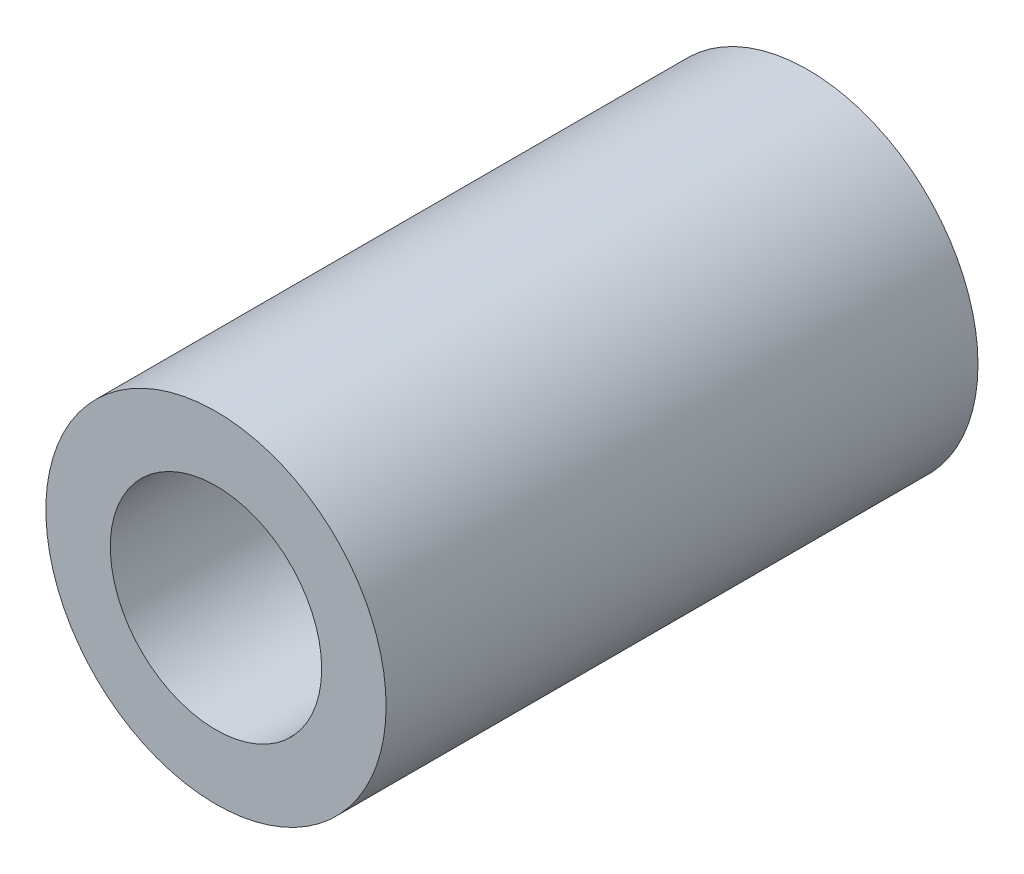
ISO-10303-21;
HEADER;
FILE_DESCRIPTION(('STEP AP214'),'2;1');
FILE_NAME('part.step','',(''),(''),'','','');
FILE_SCHEMA(('AUTOMOTIVE_DESIGN { 1 0 10303 214 1 1 1 1 }'));
ENDSEC;
DATA;
#1=APPLICATION_CONTEXT('core data for automotive mechanical design processes');
#2=APPLICATION_PROTOCOL_DEFINITION('international standard','automotive_design',2000,#1);
#3=PRODUCT_CONTEXT('',#1,'mechanical');
#4=PRODUCT('Part','Part','',(#3));
#5=PRODUCT_RELATED_PRODUCT_CATEGORY('part','',(#4));
#6=PRODUCT_DEFINITION_FORMATION('','',#4);
#7=PRODUCT_DEFINITION_CONTEXT('part definition',#1,'design');
#8=PRODUCT_DEFINITION('design','',#6,#7);
#9=PRODUCT_DEFINITION_SHAPE('','',#8);
#10=(LENGTH_UNIT() NAMED_UNIT(*) SI_UNIT(.MILLI.,.METRE.));
#11=(NAMED_UNIT(*) PLANE_ANGLE_UNIT() SI_UNIT($,.RADIAN.));
#12=(NAMED_UNIT(*) SI_UNIT($,.STERADIAN.) SOLID_ANGLE_UNIT());
#13=UNCERTAINTY_MEASURE_WITH_UNIT(LENGTH_MEASURE(1.E-05),#10,'distance_accuracy_value','');
#14=(GEOMETRIC_REPRESENTATION_CONTEXT(3) GLOBAL_UNCERTAINTY_ASSIGNED_CONTEXT((#13)) GLOBAL_UNIT_ASSIGNED_CONTEXT((#10,
#11,#12)) REPRESENTATION_CONTEXT('',''));
#15=CARTESIAN_POINT('',(0.,0.,0.));
#16=DIRECTION('',(0.,0.,1.));
#17=DIRECTION('',(1.,0.,0.));
#18=AXIS2_PLACEMENT_3D('',#15,#16,#17);
#19=CARTESIAN_POINT('',(0.,0.,11.1125));
#20=DIRECTION('',(0.,0.,1.));
#21=DIRECTION('',(1.,0.,0.));
#22=AXIS2_PLACEMENT_3D('',#19,#20,#21);
#23=PLANE('',#22);
#24=CARTESIAN_POINT('',(0.,0.,11.1125));
#25=DIRECTION('',(0.,0.,1.));
#26=DIRECTION('',(1.,0.,0.));
#27=AXIS2_PLACEMENT_3D('',#24,#25,#26);
#28=CIRCLE('',#27,6.3881);
#29=CARTESIAN_POINT('',(6.3881,0.,11.1125));
#30=VERTEX_POINT('',#29);
#31=EDGE_CURVE('E10',#30,#30,#28,.T.);
#32=ORIENTED_EDGE('',*,*,#31,.T.);
#33=EDGE_LOOP('',(#32));
#34=FACE_BOUND('',#33,.T.);
#35=CARTESIAN_POINT('',(0.,0.,11.1125));
#36=DIRECTION('',(0.,0.,1.));
#37=DIRECTION('',(1.,0.,0.));
#38=AXIS2_PLACEMENT_3D('',#35,#36,#37);
#39=CIRCLE('',#38,3.96875);
#40=CARTESIAN_POINT('',(3.96875,0.,11.1125));
#41=VERTEX_POINT('',#40);
#42=EDGE_CURVE('E46',#41,#41,#39,.T.);
#43=ORIENTED_EDGE('',*,*,#42,.F.);
#44=EDGE_LOOP('',(#43));
#45=FACE_BOUND('',#44,.T.);
#46=ADVANCED_FACE('F35',(#34,#45),#23,.T.);
#47=CARTESIAN_POINT('',(0.,0.,-11.1125));
#48=DIRECTION('',(0.,0.,1.));
#49=DIRECTION('',(1.,0.,0.));
#50=AXIS2_PLACEMENT_3D('',#47,#48,#49);
#51=PLANE('',#50);
#52=CARTESIAN_POINT('',(0.,0.,-11.1125));
#53=DIRECTION('',(0.,0.,1.));
#54=DIRECTION('',(1.,0.,0.));
#55=AXIS2_PLACEMENT_3D('',#52,#53,#54);
#56=CIRCLE('',#55,6.3881);
#57=CARTESIAN_POINT('',(6.3881,0.,-11.1125));
#58=VERTEX_POINT('',#57);
#59=EDGE_CURVE('E39',#58,#58,#56,.T.);
#60=ORIENTED_EDGE('',*,*,#59,.F.);
#61=EDGE_LOOP('',(#60));
#62=FACE_BOUND('',#61,.T.);
#63=CARTESIAN_POINT('',(0.,0.,-11.1125));
#64=DIRECTION('',(0.,0.,1.));
#65=DIRECTION('',(1.,0.,0.));
#66=AXIS2_PLACEMENT_3D('',#63,#64,#65);
#67=CIRCLE('',#66,3.96875);
#68=CARTESIAN_POINT('',(3.96875,0.,-11.1125));
#69=VERTEX_POINT('',#68);
#70=EDGE_CURVE('E48',#69,#69,#67,.T.);
#71=ORIENTED_EDGE('',*,*,#70,.T.);
#72=EDGE_LOOP('',(#71));
#73=FACE_BOUND('',#72,.T.);
#74=ADVANCED_FACE('F58',(#62,#73),#51,.F.);
#75=CARTESIAN_POINT('',(0.,0.,11.1125));
#76=DIRECTION('',(0.,0.,-1.));
#77=DIRECTION('',(-1.,0.,0.));
#78=AXIS2_PLACEMENT_3D('',#75,#76,#77);
#79=CYLINDRICAL_SURFACE('',#78,6.3881);
#80=ORIENTED_EDGE('',*,*,#31,.F.);
#81=EDGE_LOOP('',(#80));
#82=FACE_BOUND('',#81,.T.);
#83=ORIENTED_EDGE('',*,*,#59,.T.);
#84=EDGE_LOOP('',(#83));
#85=FACE_BOUND('',#84,.T.);
#86=ADVANCED_FACE('F37',(#82,#85),#79,.T.);
#87=CARTESIAN_POINT('',(0.,0.,11.1125));
#88=DIRECTION('',(0.,0.,-1.));
#89=DIRECTION('',(-1.,0.,0.));
#90=AXIS2_PLACEMENT_3D('',#87,#88,#89);
#91=CYLINDRICAL_SURFACE('',#90,3.96875);
#92=ORIENTED_EDGE('',*,*,#42,.T.);
#93=EDGE_LOOP('',(#92));
#94=FACE_BOUND('',#93,.T.);
#95=ORIENTED_EDGE('',*,*,#70,.F.);
#96=EDGE_LOOP('',(#95));
#97=FACE_BOUND('',#96,.T.);
#98=ADVANCED_FACE('F54',(#94,#97),#91,.F.);
#99=CLOSED_SHELL('',(#46,#74,#86,#98));
#100=MANIFOLD_SOLID_BREP('B2',#99);
#101=ADVANCED_BREP_SHAPE_REPRESENTATION('',(#18,#100),#14);
#102=SHAPE_DEFINITION_REPRESENTATION(#9,#101);
ENDSEC;
END-ISO-10303-21;
